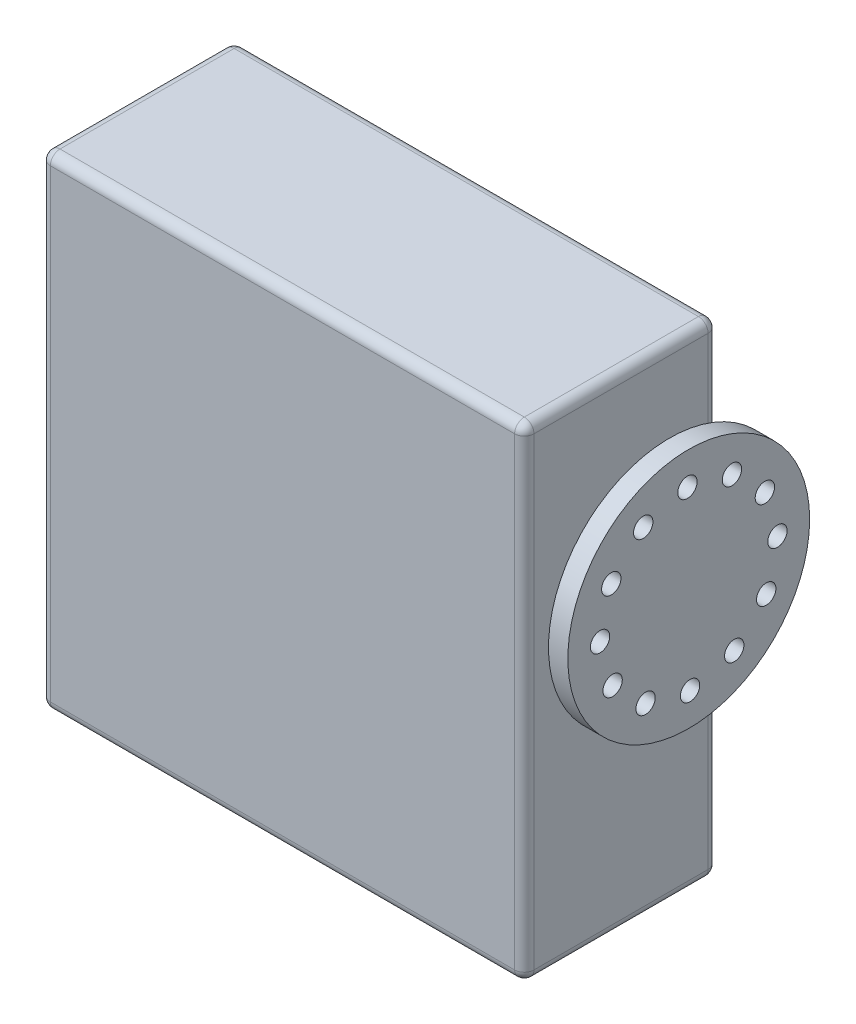
ISO-10303-21;
HEADER;
FILE_DESCRIPTION(('STEP AP214'),'2;1');
FILE_NAME('part.step','',(''),(''),'','','');
FILE_SCHEMA(('AUTOMOTIVE_DESIGN { 1 0 10303 214 1 1 1 1 }'));
ENDSEC;
DATA;
#1=APPLICATION_CONTEXT('core data for automotive mechanical design processes');
#2=APPLICATION_PROTOCOL_DEFINITION('international standard','automotive_design',2000,#1);
#3=PRODUCT_CONTEXT('',#1,'mechanical');
#4=PRODUCT('Part','Part','',(#3));
#5=PRODUCT_RELATED_PRODUCT_CATEGORY('part','',(#4));
#6=PRODUCT_DEFINITION_FORMATION('','',#4);
#7=PRODUCT_DEFINITION_CONTEXT('part definition',#1,'design');
#8=PRODUCT_DEFINITION('design','',#6,#7);
#9=PRODUCT_DEFINITION_SHAPE('','',#8);
#10=(LENGTH_UNIT() NAMED_UNIT(*) SI_UNIT(.MILLI.,.METRE.));
#11=(NAMED_UNIT(*) PLANE_ANGLE_UNIT() SI_UNIT($,.RADIAN.));
#12=(NAMED_UNIT(*) SI_UNIT($,.STERADIAN.) SOLID_ANGLE_UNIT());
#13=UNCERTAINTY_MEASURE_WITH_UNIT(LENGTH_MEASURE(1.E-05),#10,'distance_accuracy_value','');
#14=(GEOMETRIC_REPRESENTATION_CONTEXT(3) GLOBAL_UNCERTAINTY_ASSIGNED_CONTEXT((#13)) GLOBAL_UNIT_ASSIGNED_CONTEXT((#10,
#11,#12)) REPRESENTATION_CONTEXT('',''));
#15=CARTESIAN_POINT('',(0.,0.,0.));
#16=DIRECTION('',(0.,0.,1.));
#17=DIRECTION('',(1.,0.,0.));
#18=AXIS2_PLACEMENT_3D('',#15,#16,#17);
#19=CARTESIAN_POINT('',(50.,0.,20.));
#20=DIRECTION('',(-1.,0.,0.));
#21=DIRECTION('',(0.,0.,1.));
#22=AXIS2_PLACEMENT_3D('',#19,#20,#21);
#23=PLANE('',#22);
#24=DIRECTION('',(0.,0.,-1.));
#25=VECTOR('',#24,1.);
#26=CARTESIAN_POINT('',(50.,49.,20.));
#27=LINE('',#26,#25);
#28=CARTESIAN_POINT('',(50.,49.,1.));
#29=VERTEX_POINT('',#28);
#30=CARTESIAN_POINT('',(50.,49.,19.));
#31=VERTEX_POINT('',#30);
#32=EDGE_CURVE('E160',#29,#31,#27,.F.);
#33=ORIENTED_EDGE('',*,*,#32,.T.);
#34=DIRECTION('',(0.,1.,0.));
#35=VECTOR('',#34,1.);
#36=CARTESIAN_POINT('',(50.,0.,19.));
#37=LINE('',#36,#35);
#38=CARTESIAN_POINT('',(50.,1.,19.));
#39=VERTEX_POINT('',#38);
#40=EDGE_CURVE('E130',#31,#39,#37,.F.);
#41=ORIENTED_EDGE('',*,*,#40,.T.);
#42=DIRECTION('',(0.,0.,-1.));
#43=VECTOR('',#42,1.);
#44=CARTESIAN_POINT('',(50.,1.,20.));
#45=LINE('',#44,#43);
#46=CARTESIAN_POINT('',(50.,1.,1.));
#47=VERTEX_POINT('',#46);
#48=EDGE_CURVE('E167',#39,#47,#45,.T.);
#49=ORIENTED_EDGE('',*,*,#48,.T.);
#50=DIRECTION('',(0.,1.,0.));
#51=VECTOR('',#50,1.);
#52=CARTESIAN_POINT('',(50.,50.,1.));
#53=LINE('',#52,#51);
#54=EDGE_CURVE('E165',#47,#29,#53,.T.);
#55=ORIENTED_EDGE('',*,*,#54,.T.);
#56=EDGE_LOOP('',(#33,#41,#49,#55));
#57=FACE_BOUND('',#56,.T.);
#58=CARTESIAN_POINT('',(50.,34.1132623120046,10.));
#59=DIRECTION('',(-1.,0.,0.));
#60=DIRECTION('',(0.,0.,1.));
#61=AXIS2_PLACEMENT_3D('',#58,#59,#60);
#62=CIRCLE('',#61,2.5);
#63=CARTESIAN_POINT('',(50.,34.1132623120046,12.5));
#64=VERTEX_POINT('',#63);
#65=EDGE_CURVE('E153',#64,#64,#62,.F.);
#66=ORIENTED_EDGE('',*,*,#65,.F.);
#67=EDGE_LOOP('',(#66));
#68=FACE_BOUND('',#67,.T.);
#69=ADVANCED_FACE('F34',(#57,#68),#23,.F.);
#70=CARTESIAN_POINT('',(0.,0.,20.));
#71=DIRECTION('',(1.,0.,0.));
#72=DIRECTION('',(0.,0.,-1.));
#73=AXIS2_PLACEMENT_3D('',#70,#71,#72);
#74=PLANE('',#73);
#75=DIRECTION('',(0.,0.,-1.));
#76=VECTOR('',#75,1.);
#77=CARTESIAN_POINT('',(0.,1.,20.));
#78=LINE('',#77,#76);
#79=CARTESIAN_POINT('',(0.,1.,1.));
#80=VERTEX_POINT('',#79);
#81=CARTESIAN_POINT('',(0.,1.,19.));
#82=VERTEX_POINT('',#81);
#83=EDGE_CURVE('E174',#80,#82,#78,.F.);
#84=ORIENTED_EDGE('',*,*,#83,.T.);
#85=DIRECTION('',(0.,-1.,0.));
#86=VECTOR('',#85,1.);
#87=CARTESIAN_POINT('',(0.,0.,19.));
#88=LINE('',#87,#86);
#89=CARTESIAN_POINT('',(0.,49.,19.));
#90=VERTEX_POINT('',#89);
#91=EDGE_CURVE('E176',#82,#90,#88,.F.);
#92=ORIENTED_EDGE('',*,*,#91,.T.);
#93=DIRECTION('',(0.,0.,-1.));
#94=VECTOR('',#93,1.);
#95=CARTESIAN_POINT('',(0.,49.,20.));
#96=LINE('',#95,#94);
#97=CARTESIAN_POINT('',(0.,49.,1.));
#98=VERTEX_POINT('',#97);
#99=EDGE_CURVE('E170',#90,#98,#96,.T.);
#100=ORIENTED_EDGE('',*,*,#99,.T.);
#101=DIRECTION('',(0.,-1.,0.));
#102=VECTOR('',#101,1.);
#103=CARTESIAN_POINT('',(0.,0.,1.));
#104=LINE('',#103,#102);
#105=EDGE_CURVE('E172',#98,#80,#104,.T.);
#106=ORIENTED_EDGE('',*,*,#105,.T.);
#107=EDGE_LOOP('',(#84,#92,#100,#106));
#108=FACE_BOUND('',#107,.T.);
#109=ADVANCED_FACE('F281',(#108),#74,.F.);
#110=CARTESIAN_POINT('',(0.,0.,20.));
#111=DIRECTION('',(0.,1.,0.));
#112=DIRECTION('',(0.,0.,1.));
#113=AXIS2_PLACEMENT_3D('',#110,#111,#112);
#114=PLANE('',#113);
#115=DIRECTION('',(1.,0.,0.));
#116=VECTOR('',#115,1.);
#117=CARTESIAN_POINT('',(0.,0.,19.));
#118=LINE('',#117,#116);
#119=CARTESIAN_POINT('',(49.,0.,19.));
#120=VERTEX_POINT('',#119);
#121=CARTESIAN_POINT('',(1.,0.,19.));
#122=VERTEX_POINT('',#121);
#123=EDGE_CURVE('E183',#120,#122,#118,.F.);
#124=ORIENTED_EDGE('',*,*,#123,.T.);
#125=DIRECTION('',(0.,0.,-1.));
#126=VECTOR('',#125,1.);
#127=CARTESIAN_POINT('',(1.,0.,20.));
#128=LINE('',#127,#126);
#129=CARTESIAN_POINT('',(1.,0.,1.));
#130=VERTEX_POINT('',#129);
#131=EDGE_CURVE('E185',#122,#130,#128,.T.);
#132=ORIENTED_EDGE('',*,*,#131,.T.);
#133=DIRECTION('',(1.,0.,0.));
#134=VECTOR('',#133,1.);
#135=CARTESIAN_POINT('',(50.,0.,1.));
#136=LINE('',#135,#134);
#137=CARTESIAN_POINT('',(49.,0.,1.));
#138=VERTEX_POINT('',#137);
#139=EDGE_CURVE('E179',#130,#138,#136,.T.);
#140=ORIENTED_EDGE('',*,*,#139,.T.);
#141=DIRECTION('',(0.,0.,-1.));
#142=VECTOR('',#141,1.);
#143=CARTESIAN_POINT('',(49.,0.,20.));
#144=LINE('',#143,#142);
#145=EDGE_CURVE('E181',#138,#120,#144,.F.);
#146=ORIENTED_EDGE('',*,*,#145,.T.);
#147=EDGE_LOOP('',(#124,#132,#140,#146));
#148=FACE_BOUND('',#147,.T.);
#149=ADVANCED_FACE('F287',(#148),#114,.F.);
#150=CARTESIAN_POINT('',(0.,50.,20.));
#151=DIRECTION('',(0.,-1.,0.));
#152=DIRECTION('',(0.,0.,-1.));
#153=AXIS2_PLACEMENT_3D('',#150,#151,#152);
#154=PLANE('',#153);
#155=DIRECTION('',(-1.,0.,0.));
#156=VECTOR('',#155,1.);
#157=CARTESIAN_POINT('',(0.,50.,19.));
#158=LINE('',#157,#156);
#159=CARTESIAN_POINT('',(1.,50.,19.));
#160=VERTEX_POINT('',#159);
#161=CARTESIAN_POINT('',(49.,50.,19.));
#162=VERTEX_POINT('',#161);
#163=EDGE_CURVE('E43',#160,#162,#158,.F.);
#164=ORIENTED_EDGE('',*,*,#163,.T.);
#165=DIRECTION('',(0.,0.,-1.));
#166=VECTOR('',#165,1.);
#167=CARTESIAN_POINT('',(49.,50.,20.));
#168=LINE('',#167,#166);
#169=CARTESIAN_POINT('',(49.,50.,1.));
#170=VERTEX_POINT('',#169);
#171=EDGE_CURVE('E11',#162,#170,#168,.T.);
#172=ORIENTED_EDGE('',*,*,#171,.T.);
#173=DIRECTION('',(-1.,0.,0.));
#174=VECTOR('',#173,1.);
#175=CARTESIAN_POINT('',(0.,50.,1.));
#176=LINE('',#175,#174);
#177=CARTESIAN_POINT('',(1.,50.,1.));
#178=VERTEX_POINT('',#177);
#179=EDGE_CURVE('E197',#170,#178,#176,.T.);
#180=ORIENTED_EDGE('',*,*,#179,.T.);
#181=DIRECTION('',(0.,0.,-1.));
#182=VECTOR('',#181,1.);
#183=CARTESIAN_POINT('',(1.,50.,20.));
#184=LINE('',#183,#182);
#185=EDGE_CURVE('E54',#178,#160,#184,.F.);
#186=ORIENTED_EDGE('',*,*,#185,.T.);
#187=EDGE_LOOP('',(#164,#172,#180,#186));
#188=FACE_BOUND('',#187,.T.);
#189=ADVANCED_FACE('F292',(#188),#154,.F.);
#190=CARTESIAN_POINT('',(0.,0.,20.));
#191=DIRECTION('',(0.,0.,-1.));
#192=DIRECTION('',(-1.,0.,0.));
#193=AXIS2_PLACEMENT_3D('',#190,#191,#192);
#194=PLANE('',#193);
#195=DIRECTION('',(0.,-1.,0.));
#196=VECTOR('',#195,1.);
#197=CARTESIAN_POINT('',(1.,0.,20.));
#198=LINE('',#197,#196);
#199=CARTESIAN_POINT('',(1.,49.,20.));
#200=VERTEX_POINT('',#199);
#201=CARTESIAN_POINT('',(1.,1.,20.));
#202=VERTEX_POINT('',#201);
#203=EDGE_CURVE('E152',#200,#202,#198,.T.);
#204=ORIENTED_EDGE('',*,*,#203,.T.);
#205=DIRECTION('',(1.,0.,0.));
#206=VECTOR('',#205,1.);
#207=CARTESIAN_POINT('',(0.,1.,20.));
#208=LINE('',#207,#206);
#209=CARTESIAN_POINT('',(49.,1.,20.));
#210=VERTEX_POINT('',#209);
#211=EDGE_CURVE('E157',#202,#210,#208,.T.);
#212=ORIENTED_EDGE('',*,*,#211,.T.);
#213=DIRECTION('',(0.,1.,0.));
#214=VECTOR('',#213,1.);
#215=CARTESIAN_POINT('',(49.,0.,20.));
#216=LINE('',#215,#214);
#217=CARTESIAN_POINT('',(49.,49.,20.));
#218=VERTEX_POINT('',#217);
#219=EDGE_CURVE('E128',#210,#218,#216,.T.);
#220=ORIENTED_EDGE('',*,*,#219,.T.);
#221=DIRECTION('',(-1.,0.,0.));
#222=VECTOR('',#221,1.);
#223=CARTESIAN_POINT('',(0.,49.,20.));
#224=LINE('',#223,#222);
#225=EDGE_CURVE('E146',#218,#200,#224,.T.);
#226=ORIENTED_EDGE('',*,*,#225,.T.);
#227=EDGE_LOOP('',(#204,#212,#220,#226));
#228=FACE_BOUND('',#227,.T.);
#229=ADVANCED_FACE('F155',(#228),#194,.F.);
#230=CARTESIAN_POINT('',(0.,0.,0.));
#231=DIRECTION('',(0.,0.,-1.));
#232=DIRECTION('',(-1.,0.,0.));
#233=AXIS2_PLACEMENT_3D('',#230,#231,#232);
#234=PLANE('',#233);
#235=DIRECTION('',(0.,1.,0.));
#236=VECTOR('',#235,1.);
#237=CARTESIAN_POINT('',(49.,0.,0.));
#238=LINE('',#237,#236);
#239=CARTESIAN_POINT('',(49.,49.,0.));
#240=VERTEX_POINT('',#239);
#241=CARTESIAN_POINT('',(49.,1.,0.));
#242=VERTEX_POINT('',#241);
#243=EDGE_CURVE('E192',#240,#242,#238,.F.);
#244=ORIENTED_EDGE('',*,*,#243,.T.);
#245=DIRECTION('',(1.,0.,0.));
#246=VECTOR('',#245,1.);
#247=CARTESIAN_POINT('',(0.,1.,0.));
#248=LINE('',#247,#246);
#249=CARTESIAN_POINT('',(1.,1.,0.));
#250=VERTEX_POINT('',#249);
#251=EDGE_CURVE('E194',#242,#250,#248,.F.);
#252=ORIENTED_EDGE('',*,*,#251,.T.);
#253=DIRECTION('',(0.,-1.,0.));
#254=VECTOR('',#253,1.);
#255=CARTESIAN_POINT('',(1.,50.,0.));
#256=LINE('',#255,#254);
#257=CARTESIAN_POINT('',(1.,49.,0.));
#258=VERTEX_POINT('',#257);
#259=EDGE_CURVE('E190',#250,#258,#256,.F.);
#260=ORIENTED_EDGE('',*,*,#259,.T.);
#261=DIRECTION('',(-1.,0.,0.));
#262=VECTOR('',#261,1.);
#263=CARTESIAN_POINT('',(50.,49.,0.));
#264=LINE('',#263,#262);
#265=EDGE_CURVE('E188',#258,#240,#264,.F.);
#266=ORIENTED_EDGE('',*,*,#265,.T.);
#267=EDGE_LOOP('',(#244,#252,#260,#266));
#268=FACE_BOUND('',#267,.T.);
#269=ADVANCED_FACE('F380',(#268),#234,.T.);
#270=CARTESIAN_POINT('',(55.,34.1132623120046,10.));
#271=DIRECTION('',(-1.,0.,0.));
#272=DIRECTION('',(0.,0.,1.));
#273=AXIS2_PLACEMENT_3D('',#270,#271,#272);
#274=CYLINDRICAL_SURFACE('',#273,2.5);
#275=CARTESIAN_POINT('',(55.,34.1132623120046,10.));
#276=DIRECTION('',(1.,0.,0.));
#277=DIRECTION('',(0.,0.,-1.));
#278=AXIS2_PLACEMENT_3D('',#275,#276,#277);
#279=CIRCLE('',#278,2.5);
#280=CARTESIAN_POINT('',(55.,34.1132623120046,7.5));
#281=VERTEX_POINT('',#280);
#282=EDGE_CURVE('E269',#281,#281,#279,.T.);
#283=ORIENTED_EDGE('',*,*,#282,.F.);
#284=EDGE_LOOP('',(#283));
#285=FACE_BOUND('',#284,.T.);
#286=ORIENTED_EDGE('',*,*,#65,.T.);
#287=EDGE_LOOP('',(#286));
#288=FACE_BOUND('',#287,.T.);
#289=ADVANCED_FACE('F278',(#285,#288),#274,.T.);
#290=CARTESIAN_POINT('',(55.,34.1132623120046,10.));
#291=DIRECTION('',(1.,0.,0.));
#292=DIRECTION('',(0.,0.,-1.));
#293=AXIS2_PLACEMENT_3D('',#290,#291,#292);
#294=PLANE('',#293);
#295=CARTESIAN_POINT('',(55.,38.8173121010036,2.1291466211071));
#296=DIRECTION('',(1.,0.,0.));
#297=DIRECTION('',(0.,0.,-1.));
#298=AXIS2_PLACEMENT_3D('',#295,#296,#297);
#299=CIRCLE('',#298,0.999999999999994);
#300=CARTESIAN_POINT('',(55.,38.8173121010036,1.1291466211071));
#301=VERTEX_POINT('',#300);
#302=EDGE_CURVE('E471',#301,#301,#299,.T.);
#303=ORIENTED_EDGE('',*,*,#302,.T.);
#304=EDGE_LOOP('',(#303));
#305=FACE_BOUND('',#304,.T.);
#306=CARTESIAN_POINT('',(55.,42.122515619391,5.53566591891567));
#307=DIRECTION('',(1.,0.,0.));
#308=DIRECTION('',(0.,0.,-1.));
#309=AXIS2_PLACEMENT_3D('',#306,#307,#308);
#310=CIRCLE('',#309,0.999999999999994);
#311=CARTESIAN_POINT('',(55.,42.122515619391,4.53566591891568));
#312=VERTEX_POINT('',#311);
#313=EDGE_CURVE('E481',#312,#312,#310,.T.);
#314=ORIENTED_EDGE('',*,*,#313,.T.);
#315=EDGE_LOOP('',(#314));
#316=FACE_BOUND('',#315,.T.);
#317=CARTESIAN_POINT('',(55.,43.281646182088,10.1383999284935));
#318=DIRECTION('',(1.,0.,0.));
#319=DIRECTION('',(0.,0.,-1.));
#320=AXIS2_PLACEMENT_3D('',#317,#318,#319);
#321=CIRCLE('',#320,0.999999999999994);
#322=CARTESIAN_POINT('',(55.,43.281646182088,9.13839992849354));
#323=VERTEX_POINT('',#322);
#324=EDGE_CURVE('E487',#323,#323,#321,.T.);
#325=ORIENTED_EDGE('',*,*,#324,.T.);
#326=EDGE_LOOP('',(#325));
#327=FACE_BOUND('',#326,.T.);
#328=CARTESIAN_POINT('',(55.,41.9841156908975,14.704049788999));
#329=DIRECTION('',(1.,0.,0.));
#330=DIRECTION('',(0.,0.,-1.));
#331=AXIS2_PLACEMENT_3D('',#328,#329,#330);
#332=CIRCLE('',#331,0.999999999999994);
#333=CARTESIAN_POINT('',(55.,41.9841156908975,13.704049788999));
#334=VERTEX_POINT('',#333);
#335=EDGE_CURVE('E493',#334,#334,#332,.T.);
#336=ORIENTED_EDGE('',*,*,#335,.T.);
#337=EDGE_LOOP('',(#336));
#338=FACE_BOUND('',#337,.T.);
#339=CARTESIAN_POINT('',(55.,38.5775963930889,18.0092533073864));
#340=DIRECTION('',(1.,0.,0.));
#341=DIRECTION('',(0.,0.,-1.));
#342=AXIS2_PLACEMENT_3D('',#339,#340,#341);
#343=CIRCLE('',#342,0.999999999999994);
#344=CARTESIAN_POINT('',(55.,38.5775963930889,17.0092533073864));
#345=VERTEX_POINT('',#344);
#346=EDGE_CURVE('E499',#345,#345,#343,.T.);
#347=ORIENTED_EDGE('',*,*,#346,.T.);
#348=EDGE_LOOP('',(#347));
#349=FACE_BOUND('',#348,.T.);
#350=CARTESIAN_POINT('',(55.,33.974862383511,19.1683838700833));
#351=DIRECTION('',(1.,0.,0.));
#352=DIRECTION('',(0.,0.,-1.));
#353=AXIS2_PLACEMENT_3D('',#350,#351,#352);
#354=CIRCLE('',#353,0.999999999999994);
#355=CARTESIAN_POINT('',(55.,33.974862383511,18.1683838700833));
#356=VERTEX_POINT('',#355);
#357=EDGE_CURVE('E505',#356,#356,#354,.T.);
#358=ORIENTED_EDGE('',*,*,#357,.T.);
#359=EDGE_LOOP('',(#358));
#360=FACE_BOUND('',#359,.T.);
#361=CARTESIAN_POINT('',(55.,29.4092125230056,17.8708533788929));
#362=DIRECTION('',(1.,0.,0.));
#363=DIRECTION('',(0.,0.,-1.));
#364=AXIS2_PLACEMENT_3D('',#361,#362,#363);
#365=CIRCLE('',#364,0.999999999999994);
#366=CARTESIAN_POINT('',(55.,29.4092125230056,16.8708533788929));
#367=VERTEX_POINT('',#366);
#368=EDGE_CURVE('E511',#367,#367,#365,.T.);
#369=ORIENTED_EDGE('',*,*,#368,.T.);
#370=EDGE_LOOP('',(#369));
#371=FACE_BOUND('',#370,.T.);
#372=CARTESIAN_POINT('',(55.,26.1040090046182,14.4643340810843));
#373=DIRECTION('',(1.,0.,0.));
#374=DIRECTION('',(0.,0.,-1.));
#375=AXIS2_PLACEMENT_3D('',#372,#373,#374);
#376=CIRCLE('',#375,0.999999999999994);
#377=CARTESIAN_POINT('',(55.,26.1040090046182,13.4643340810843));
#378=VERTEX_POINT('',#377);
#379=EDGE_CURVE('E517',#378,#378,#376,.T.);
#380=ORIENTED_EDGE('',*,*,#379,.T.);
#381=EDGE_LOOP('',(#380));
#382=FACE_BOUND('',#381,.T.);
#383=CARTESIAN_POINT('',(55.,24.9448784419213,9.86160007150641));
#384=DIRECTION('',(1.,0.,0.));
#385=DIRECTION('',(0.,0.,-1.));
#386=AXIS2_PLACEMENT_3D('',#383,#384,#385);
#387=CIRCLE('',#386,0.999999999999994);
#388=CARTESIAN_POINT('',(55.,24.9448784419213,8.86160007150642));
#389=VERTEX_POINT('',#388);
#390=EDGE_CURVE('E523',#389,#389,#387,.T.);
#391=ORIENTED_EDGE('',*,*,#390,.T.);
#392=EDGE_LOOP('',(#391));
#393=FACE_BOUND('',#392,.T.);
#394=CARTESIAN_POINT('',(55.,26.2424089331118,5.29595021100093));
#395=DIRECTION('',(1.,0.,0.));
#396=DIRECTION('',(0.,0.,-1.));
#397=AXIS2_PLACEMENT_3D('',#394,#395,#396);
#398=CIRCLE('',#397,0.999999999999994);
#399=CARTESIAN_POINT('',(55.,26.2424089331118,4.29595021100093));
#400=VERTEX_POINT('',#399);
#401=EDGE_CURVE('E529',#400,#400,#398,.T.);
#402=ORIENTED_EDGE('',*,*,#401,.T.);
#403=EDGE_LOOP('',(#402));
#404=FACE_BOUND('',#403,.T.);
#405=CARTESIAN_POINT('',(55.,29.6489282309204,1.99074669261354));
#406=DIRECTION('',(1.,0.,0.));
#407=DIRECTION('',(0.,0.,-1.));
#408=AXIS2_PLACEMENT_3D('',#405,#406,#407);
#409=CIRCLE('',#408,0.999999999999994);
#410=CARTESIAN_POINT('',(55.,29.6489282309204,0.990746692613547));
#411=VERTEX_POINT('',#410);
#412=EDGE_CURVE('E535',#411,#411,#409,.T.);
#413=ORIENTED_EDGE('',*,*,#412,.T.);
#414=EDGE_LOOP('',(#413));
#415=FACE_BOUND('',#414,.T.);
#416=CARTESIAN_POINT('',(55.,34.2516622404982,0.831616129916668));
#417=DIRECTION('',(1.,0.,0.));
#418=DIRECTION('',(0.,0.,-1.));
#419=AXIS2_PLACEMENT_3D('',#416,#417,#418);
#420=CIRCLE('',#419,0.999999999999994);
#421=CARTESIAN_POINT('',(55.,34.2516622404982,-0.168383870083326));
#422=VERTEX_POINT('',#421);
#423=EDGE_CURVE('E134',#422,#422,#420,.T.);
#424=ORIENTED_EDGE('',*,*,#423,.T.);
#425=EDGE_LOOP('',(#424));
#426=FACE_BOUND('',#425,.T.);
#427=CARTESIAN_POINT('',(55.,34.1132623120046,10.));
#428=DIRECTION('',(1.,0.,0.));
#429=DIRECTION('',(0.,0.,-1.));
#430=AXIS2_PLACEMENT_3D('',#427,#428,#429);
#431=CIRCLE('',#430,12.5);
#432=CARTESIAN_POINT('',(55.,34.1132623120046,-2.5));
#433=VERTEX_POINT('',#432);
#434=EDGE_CURVE('E257',#433,#433,#431,.T.);
#435=ORIENTED_EDGE('',*,*,#434,.F.);
#436=EDGE_LOOP('',(#435));
#437=FACE_BOUND('',#436,.T.);
#438=ORIENTED_EDGE('',*,*,#282,.T.);
#439=EDGE_LOOP('',(#438));
#440=FACE_BOUND('',#439,.T.);
#441=ADVANCED_FACE('F408',(#305,#316,#327,#338,#349,#360,#371,#382,#393,#404,#415,#426,#437,
#440),#294,.F.);
#442=CARTESIAN_POINT('',(57.,34.1132623120046,10.));
#443=DIRECTION('',(-1.,0.,0.));
#444=DIRECTION('',(0.,0.,1.));
#445=AXIS2_PLACEMENT_3D('',#442,#443,#444);
#446=CYLINDRICAL_SURFACE('',#445,12.5);
#447=CARTESIAN_POINT('',(57.,34.1132623120046,10.));
#448=DIRECTION('',(1.,0.,0.));
#449=DIRECTION('',(0.,0.,-1.));
#450=AXIS2_PLACEMENT_3D('',#447,#448,#449);
#451=CIRCLE('',#450,12.5);
#452=CARTESIAN_POINT('',(57.,34.1132623120046,-2.5));
#453=VERTEX_POINT('',#452);
#454=EDGE_CURVE('E264',#453,#453,#451,.T.);
#455=ORIENTED_EDGE('',*,*,#454,.F.);
#456=EDGE_LOOP('',(#455));
#457=FACE_BOUND('',#456,.T.);
#458=ORIENTED_EDGE('',*,*,#434,.T.);
#459=EDGE_LOOP('',(#458));
#460=FACE_BOUND('',#459,.T.);
#461=ADVANCED_FACE('F410',(#457,#460),#446,.T.);
#462=CARTESIAN_POINT('',(57.,34.1132623120046,10.));
#463=DIRECTION('',(1.,0.,0.));
#464=DIRECTION('',(0.,0.,-1.));
#465=AXIS2_PLACEMENT_3D('',#462,#463,#464);
#466=PLANE('',#465);
#467=CARTESIAN_POINT('',(57.,38.8173121010036,2.1291466211071));
#468=DIRECTION('',(1.,0.,0.));
#469=DIRECTION('',(0.,0.,-1.));
#470=AXIS2_PLACEMENT_3D('',#467,#468,#469);
#471=CIRCLE('',#470,0.999999999999987);
#472=CARTESIAN_POINT('',(57.,38.8173121010036,1.12914662110711));
#473=VERTEX_POINT('',#472);
#474=EDGE_CURVE('E474',#473,#473,#471,.T.);
#475=ORIENTED_EDGE('',*,*,#474,.F.);
#476=EDGE_LOOP('',(#475));
#477=FACE_BOUND('',#476,.T.);
#478=CARTESIAN_POINT('',(57.,42.122515619391,5.53566591891567));
#479=DIRECTION('',(1.,0.,0.));
#480=DIRECTION('',(0.,0.,-1.));
#481=AXIS2_PLACEMENT_3D('',#478,#479,#480);
#482=CIRCLE('',#481,0.999999999999987);
#483=CARTESIAN_POINT('',(57.,42.122515619391,4.53566591891568));
#484=VERTEX_POINT('',#483);
#485=EDGE_CURVE('E476',#484,#484,#482,.T.);
#486=ORIENTED_EDGE('',*,*,#485,.F.);
#487=EDGE_LOOP('',(#486));
#488=FACE_BOUND('',#487,.T.);
#489=CARTESIAN_POINT('',(57.,43.281646182088,10.1383999284935));
#490=DIRECTION('',(1.,0.,0.));
#491=DIRECTION('',(0.,0.,-1.));
#492=AXIS2_PLACEMENT_3D('',#489,#490,#491);
#493=CIRCLE('',#492,0.999999999999987);
#494=CARTESIAN_POINT('',(57.,43.281646182088,9.13839992849354));
#495=VERTEX_POINT('',#494);
#496=EDGE_CURVE('E484',#495,#495,#493,.T.);
#497=ORIENTED_EDGE('',*,*,#496,.F.);
#498=EDGE_LOOP('',(#497));
#499=FACE_BOUND('',#498,.T.);
#500=CARTESIAN_POINT('',(57.,41.9841156908975,14.704049788999));
#501=DIRECTION('',(1.,0.,0.));
#502=DIRECTION('',(0.,0.,-1.));
#503=AXIS2_PLACEMENT_3D('',#500,#501,#502);
#504=CIRCLE('',#503,0.999999999999987);
#505=CARTESIAN_POINT('',(57.,41.9841156908975,13.704049788999));
#506=VERTEX_POINT('',#505);
#507=EDGE_CURVE('E490',#506,#506,#504,.T.);
#508=ORIENTED_EDGE('',*,*,#507,.F.);
#509=EDGE_LOOP('',(#508));
#510=FACE_BOUND('',#509,.T.);
#511=CARTESIAN_POINT('',(57.,38.5775963930889,18.0092533073864));
#512=DIRECTION('',(1.,0.,0.));
#513=DIRECTION('',(0.,0.,-1.));
#514=AXIS2_PLACEMENT_3D('',#511,#512,#513);
#515=CIRCLE('',#514,0.999999999999987);
#516=CARTESIAN_POINT('',(57.,38.5775963930889,17.0092533073864));
#517=VERTEX_POINT('',#516);
#518=EDGE_CURVE('E496',#517,#517,#515,.T.);
#519=ORIENTED_EDGE('',*,*,#518,.F.);
#520=EDGE_LOOP('',(#519));
#521=FACE_BOUND('',#520,.T.);
#522=CARTESIAN_POINT('',(57.,33.974862383511,19.1683838700833));
#523=DIRECTION('',(1.,0.,0.));
#524=DIRECTION('',(0.,0.,-1.));
#525=AXIS2_PLACEMENT_3D('',#522,#523,#524);
#526=CIRCLE('',#525,0.999999999999987);
#527=CARTESIAN_POINT('',(57.,33.974862383511,18.1683838700833));
#528=VERTEX_POINT('',#527);
#529=EDGE_CURVE('E502',#528,#528,#526,.T.);
#530=ORIENTED_EDGE('',*,*,#529,.F.);
#531=EDGE_LOOP('',(#530));
#532=FACE_BOUND('',#531,.T.);
#533=CARTESIAN_POINT('',(57.,29.4092125230056,17.8708533788929));
#534=DIRECTION('',(1.,0.,0.));
#535=DIRECTION('',(0.,0.,-1.));
#536=AXIS2_PLACEMENT_3D('',#533,#534,#535);
#537=CIRCLE('',#536,0.99999999999999);
#538=CARTESIAN_POINT('',(57.,29.4092125230056,16.8708533788929));
#539=VERTEX_POINT('',#538);
#540=EDGE_CURVE('E508',#539,#539,#537,.T.);
#541=ORIENTED_EDGE('',*,*,#540,.F.);
#542=EDGE_LOOP('',(#541));
#543=FACE_BOUND('',#542,.T.);
#544=CARTESIAN_POINT('',(57.,26.1040090046182,14.4643340810843));
#545=DIRECTION('',(1.,0.,0.));
#546=DIRECTION('',(0.,0.,-1.));
#547=AXIS2_PLACEMENT_3D('',#544,#545,#546);
#548=CIRCLE('',#547,0.999999999999987);
#549=CARTESIAN_POINT('',(57.,26.1040090046182,13.4643340810843));
#550=VERTEX_POINT('',#549);
#551=EDGE_CURVE('E514',#550,#550,#548,.T.);
#552=ORIENTED_EDGE('',*,*,#551,.F.);
#553=EDGE_LOOP('',(#552));
#554=FACE_BOUND('',#553,.T.);
#555=CARTESIAN_POINT('',(57.,24.9448784419213,9.86160007150641));
#556=DIRECTION('',(1.,0.,0.));
#557=DIRECTION('',(0.,0.,-1.));
#558=AXIS2_PLACEMENT_3D('',#555,#556,#557);
#559=CIRCLE('',#558,0.99999999999999);
#560=CARTESIAN_POINT('',(57.,24.9448784419213,8.86160007150642));
#561=VERTEX_POINT('',#560);
#562=EDGE_CURVE('E520',#561,#561,#559,.T.);
#563=ORIENTED_EDGE('',*,*,#562,.F.);
#564=EDGE_LOOP('',(#563));
#565=FACE_BOUND('',#564,.T.);
#566=CARTESIAN_POINT('',(57.,26.2424089331118,5.29595021100093));
#567=DIRECTION('',(1.,0.,0.));
#568=DIRECTION('',(0.,0.,-1.));
#569=AXIS2_PLACEMENT_3D('',#566,#567,#568);
#570=CIRCLE('',#569,0.999999999999987);
#571=CARTESIAN_POINT('',(57.,26.2424089331118,4.29595021100094));
#572=VERTEX_POINT('',#571);
#573=EDGE_CURVE('E526',#572,#572,#570,.T.);
#574=ORIENTED_EDGE('',*,*,#573,.F.);
#575=EDGE_LOOP('',(#574));
#576=FACE_BOUND('',#575,.T.);
#577=CARTESIAN_POINT('',(57.,29.6489282309204,1.99074669261354));
#578=DIRECTION('',(1.,0.,0.));
#579=DIRECTION('',(0.,0.,-1.));
#580=AXIS2_PLACEMENT_3D('',#577,#578,#579);
#581=CIRCLE('',#580,0.999999999999987);
#582=CARTESIAN_POINT('',(57.,29.6489282309204,0.990746692613554));
#583=VERTEX_POINT('',#582);
#584=EDGE_CURVE('E532',#583,#583,#581,.T.);
#585=ORIENTED_EDGE('',*,*,#584,.F.);
#586=EDGE_LOOP('',(#585));
#587=FACE_BOUND('',#586,.T.);
#588=CARTESIAN_POINT('',(57.,34.2516622404982,0.831616129916668));
#589=DIRECTION('',(1.,0.,0.));
#590=DIRECTION('',(0.,0.,-1.));
#591=AXIS2_PLACEMENT_3D('',#588,#589,#590);
#592=CIRCLE('',#591,0.999999999999987);
#593=CARTESIAN_POINT('',(57.,34.2516622404982,-0.168383870083319));
#594=VERTEX_POINT('',#593);
#595=EDGE_CURVE('E538',#594,#594,#592,.T.);
#596=ORIENTED_EDGE('',*,*,#595,.F.);
#597=EDGE_LOOP('',(#596));
#598=FACE_BOUND('',#597,.T.);
#599=ORIENTED_EDGE('',*,*,#454,.T.);
#600=EDGE_LOOP('',(#599));
#601=FACE_BOUND('',#600,.T.);
#602=ADVANCED_FACE('F367',(#477,#488,#499,#510,#521,#532,#543,#554,#565,#576,#587,#598,#601),
#466,.T.);
#603=CARTESIAN_POINT('',(1.,0.,1.));
#604=DIRECTION('',(0.,1.,0.));
#605=DIRECTION('',(0.,0.,1.));
#606=AXIS2_PLACEMENT_3D('',#603,#604,#605);
#607=CYLINDRICAL_SURFACE('',#606,1.);
#608=CARTESIAN_POINT('',(1.,1.,1.));
#609=DIRECTION('',(0.,-1.,0.));
#610=DIRECTION('',(0.,0.,-1.));
#611=AXIS2_PLACEMENT_3D('',#608,#609,#610);
#612=CIRCLE('',#611,1.);
#613=EDGE_CURVE('E38',#80,#250,#612,.T.);
#614=ORIENTED_EDGE('',*,*,#613,.F.);
#615=ORIENTED_EDGE('',*,*,#105,.F.);
#616=CARTESIAN_POINT('',(1.,49.,1.));
#617=DIRECTION('',(0.,1.,0.));
#618=DIRECTION('',(0.,0.,1.));
#619=AXIS2_PLACEMENT_3D('',#616,#617,#618);
#620=CIRCLE('',#619,1.);
#621=EDGE_CURVE('E250',#258,#98,#620,.T.);
#622=ORIENTED_EDGE('',*,*,#621,.F.);
#623=ORIENTED_EDGE('',*,*,#259,.F.);
#624=EDGE_LOOP('',(#614,#615,#622,#623));
#625=FACE_BOUND('',#624,.T.);
#626=ADVANCED_FACE('F36',(#625),#607,.T.);
#627=CARTESIAN_POINT('',(1.,1.,1.));
#628=DIRECTION('',(0.,0.,1.));
#629=DIRECTION('',(1.,0.,0.));
#630=AXIS2_PLACEMENT_3D('',#627,#628,#629);
#631=SPHERICAL_SURFACE('',#630,1.);
#632=CARTESIAN_POINT('',(1.,1.,1.));
#633=DIRECTION('',(0.,0.,-1.));
#634=DIRECTION('',(-1.,0.,0.));
#635=AXIS2_PLACEMENT_3D('',#632,#633,#634);
#636=CIRCLE('',#635,1.);
#637=EDGE_CURVE('E246',#80,#130,#636,.F.);
#638=ORIENTED_EDGE('',*,*,#637,.F.);
#639=ORIENTED_EDGE('',*,*,#613,.T.);
#640=CARTESIAN_POINT('',(1.,1.,1.));
#641=DIRECTION('',(-1.,0.,0.));
#642=DIRECTION('',(0.,0.,1.));
#643=AXIS2_PLACEMENT_3D('',#640,#641,#642);
#644=CIRCLE('',#643,1.);
#645=EDGE_CURVE('E249',#130,#250,#644,.F.);
#646=ORIENTED_EDGE('',*,*,#645,.F.);
#647=EDGE_LOOP('',(#638,#639,#646));
#648=FACE_BOUND('',#647,.T.);
#649=ADVANCED_FACE('F362',(#648),#631,.T.);
#650=CARTESIAN_POINT('',(1.,49.,1.));
#651=DIRECTION('',(0.,0.,1.));
#652=DIRECTION('',(1.,0.,0.));
#653=AXIS2_PLACEMENT_3D('',#650,#651,#652);
#654=SPHERICAL_SURFACE('',#653,1.);
#655=CARTESIAN_POINT('',(1.,49.,1.));
#656=DIRECTION('',(-1.,0.,0.));
#657=DIRECTION('',(0.,0.,1.));
#658=AXIS2_PLACEMENT_3D('',#655,#656,#657);
#659=CIRCLE('',#658,1.);
#660=EDGE_CURVE('E240',#258,#178,#659,.F.);
#661=ORIENTED_EDGE('',*,*,#660,.F.);
#662=ORIENTED_EDGE('',*,*,#621,.T.);
#663=CARTESIAN_POINT('',(1.,49.,1.));
#664=DIRECTION('',(0.,0.,-1.));
#665=DIRECTION('',(-1.,0.,0.));
#666=AXIS2_PLACEMENT_3D('',#663,#664,#665);
#667=CIRCLE('',#666,1.);
#668=EDGE_CURVE('E243',#178,#98,#667,.F.);
#669=ORIENTED_EDGE('',*,*,#668,.F.);
#670=EDGE_LOOP('',(#661,#662,#669));
#671=FACE_BOUND('',#670,.T.);
#672=ADVANCED_FACE('F359',(#671),#654,.T.);
#673=CARTESIAN_POINT('',(0.,1.,1.));
#674=DIRECTION('',(-1.,0.,0.));
#675=DIRECTION('',(0.,0.,1.));
#676=AXIS2_PLACEMENT_3D('',#673,#674,#675);
#677=CYLINDRICAL_SURFACE('',#676,1.);
#678=ORIENTED_EDGE('',*,*,#645,.T.);
#679=ORIENTED_EDGE('',*,*,#251,.F.);
#680=CARTESIAN_POINT('',(49.,1.,1.));
#681=DIRECTION('',(1.,0.,0.));
#682=DIRECTION('',(0.,0.,-1.));
#683=AXIS2_PLACEMENT_3D('',#680,#681,#682);
#684=CIRCLE('',#683,1.);
#685=EDGE_CURVE('E234',#138,#242,#684,.T.);
#686=ORIENTED_EDGE('',*,*,#685,.F.);
#687=ORIENTED_EDGE('',*,*,#139,.F.);
#688=EDGE_LOOP('',(#678,#679,#686,#687));
#689=FACE_BOUND('',#688,.T.);
#690=ADVANCED_FACE('F355',(#689),#677,.T.);
#691=CARTESIAN_POINT('',(1.,1.,20.));
#692=DIRECTION('',(0.,0.,-1.));
#693=DIRECTION('',(-1.,0.,0.));
#694=AXIS2_PLACEMENT_3D('',#691,#692,#693);
#695=CYLINDRICAL_SURFACE('',#694,1.);
#696=ORIENTED_EDGE('',*,*,#637,.T.);
#697=ORIENTED_EDGE('',*,*,#131,.F.);
#698=CARTESIAN_POINT('',(1.,1.,19.));
#699=DIRECTION('',(0.,0.,1.));
#700=DIRECTION('',(1.,0.,0.));
#701=AXIS2_PLACEMENT_3D('',#698,#699,#700);
#702=CIRCLE('',#701,1.);
#703=EDGE_CURVE('E231',#82,#122,#702,.T.);
#704=ORIENTED_EDGE('',*,*,#703,.F.);
#705=ORIENTED_EDGE('',*,*,#83,.F.);
#706=EDGE_LOOP('',(#696,#697,#704,#705));
#707=FACE_BOUND('',#706,.T.);
#708=ADVANCED_FACE('F351',(#707),#695,.T.);
#709=CARTESIAN_POINT('',(1.,0.,19.));
#710=DIRECTION('',(0.,-1.,0.));
#711=DIRECTION('',(0.,0.,-1.));
#712=AXIS2_PLACEMENT_3D('',#709,#710,#711);
#713=CYLINDRICAL_SURFACE('',#712,1.);
#714=CARTESIAN_POINT('',(1.,49.,19.));
#715=DIRECTION('',(0.,1.,0.));
#716=DIRECTION('',(0.,0.,1.));
#717=AXIS2_PLACEMENT_3D('',#714,#715,#716);
#718=CIRCLE('',#717,1.);
#719=EDGE_CURVE('E225',#90,#200,#718,.T.);
#720=ORIENTED_EDGE('',*,*,#719,.F.);
#721=ORIENTED_EDGE('',*,*,#91,.F.);
#722=CARTESIAN_POINT('',(1.,1.,19.));
#723=DIRECTION('',(0.,-1.,0.));
#724=DIRECTION('',(0.,0.,-1.));
#725=AXIS2_PLACEMENT_3D('',#722,#723,#724);
#726=CIRCLE('',#725,1.);
#727=EDGE_CURVE('E228',#202,#82,#726,.T.);
#728=ORIENTED_EDGE('',*,*,#727,.F.);
#729=ORIENTED_EDGE('',*,*,#203,.F.);
#730=EDGE_LOOP('',(#720,#721,#728,#729));
#731=FACE_BOUND('',#730,.T.);
#732=ADVANCED_FACE('F347',(#731),#713,.T.);
#733=CARTESIAN_POINT('',(1.,49.,20.));
#734=DIRECTION('',(0.,0.,-1.));
#735=DIRECTION('',(-1.,0.,0.));
#736=AXIS2_PLACEMENT_3D('',#733,#734,#735);
#737=CYLINDRICAL_SURFACE('',#736,1.);
#738=ORIENTED_EDGE('',*,*,#668,.T.);
#739=ORIENTED_EDGE('',*,*,#99,.F.);
#740=CARTESIAN_POINT('',(1.,49.,19.));
#741=DIRECTION('',(0.,0.,1.));
#742=DIRECTION('',(1.,0.,0.));
#743=AXIS2_PLACEMENT_3D('',#740,#741,#742);
#744=CIRCLE('',#743,1.);
#745=EDGE_CURVE('E223',#160,#90,#744,.T.);
#746=ORIENTED_EDGE('',*,*,#745,.F.);
#747=ORIENTED_EDGE('',*,*,#185,.F.);
#748=EDGE_LOOP('',(#738,#739,#746,#747));
#749=FACE_BOUND('',#748,.T.);
#750=ADVANCED_FACE('F343',(#749),#737,.T.);
#751=CARTESIAN_POINT('',(0.,49.,1.));
#752=DIRECTION('',(1.,0.,0.));
#753=DIRECTION('',(0.,0.,-1.));
#754=AXIS2_PLACEMENT_3D('',#751,#752,#753);
#755=CYLINDRICAL_SURFACE('',#754,1.);
#756=ORIENTED_EDGE('',*,*,#660,.T.);
#757=ORIENTED_EDGE('',*,*,#179,.F.);
#758=CARTESIAN_POINT('',(49.,49.,1.));
#759=DIRECTION('',(1.,0.,0.));
#760=DIRECTION('',(0.,0.,-1.));
#761=AXIS2_PLACEMENT_3D('',#758,#759,#760);
#762=CIRCLE('',#761,1.);
#763=EDGE_CURVE('E220',#240,#170,#762,.T.);
#764=ORIENTED_EDGE('',*,*,#763,.F.);
#765=ORIENTED_EDGE('',*,*,#265,.F.);
#766=EDGE_LOOP('',(#756,#757,#764,#765));
#767=FACE_BOUND('',#766,.T.);
#768=ADVANCED_FACE('F339',(#767),#755,.T.);
#769=CARTESIAN_POINT('',(49.,0.,1.));
#770=DIRECTION('',(0.,-1.,0.));
#771=DIRECTION('',(0.,0.,-1.));
#772=AXIS2_PLACEMENT_3D('',#769,#770,#771);
#773=CYLINDRICAL_SURFACE('',#772,1.);
#774=CARTESIAN_POINT('',(49.,1.,1.));
#775=DIRECTION('',(0.,-1.,0.));
#776=DIRECTION('',(0.,0.,-1.));
#777=AXIS2_PLACEMENT_3D('',#774,#775,#776);
#778=CIRCLE('',#777,1.);
#779=EDGE_CURVE('E237',#242,#47,#778,.T.);
#780=ORIENTED_EDGE('',*,*,#779,.F.);
#781=ORIENTED_EDGE('',*,*,#243,.F.);
#782=CARTESIAN_POINT('',(49.,49.,1.));
#783=DIRECTION('',(0.,1.,0.));
#784=DIRECTION('',(0.,0.,1.));
#785=AXIS2_PLACEMENT_3D('',#782,#783,#784);
#786=CIRCLE('',#785,1.);
#787=EDGE_CURVE('E217',#29,#240,#786,.T.);
#788=ORIENTED_EDGE('',*,*,#787,.F.);
#789=ORIENTED_EDGE('',*,*,#54,.F.);
#790=EDGE_LOOP('',(#780,#781,#788,#789));
#791=FACE_BOUND('',#790,.T.);
#792=ADVANCED_FACE('F335',(#791),#773,.T.);
#793=CARTESIAN_POINT('',(49.,1.,1.));
#794=DIRECTION('',(0.,0.,1.));
#795=DIRECTION('',(1.,0.,0.));
#796=AXIS2_PLACEMENT_3D('',#793,#794,#795);
#797=SPHERICAL_SURFACE('',#796,1.);
#798=ORIENTED_EDGE('',*,*,#685,.T.);
#799=ORIENTED_EDGE('',*,*,#779,.T.);
#800=CARTESIAN_POINT('',(49.,1.,1.));
#801=DIRECTION('',(0.,0.,-1.));
#802=DIRECTION('',(-1.,0.,0.));
#803=AXIS2_PLACEMENT_3D('',#800,#801,#802);
#804=CIRCLE('',#803,1.);
#805=EDGE_CURVE('E214',#138,#47,#804,.F.);
#806=ORIENTED_EDGE('',*,*,#805,.F.);
#807=EDGE_LOOP('',(#798,#799,#806));
#808=FACE_BOUND('',#807,.T.);
#809=ADVANCED_FACE('F331',(#808),#797,.T.);
#810=CARTESIAN_POINT('',(1.,1.,19.));
#811=DIRECTION('',(0.,0.,1.));
#812=DIRECTION('',(1.,0.,0.));
#813=AXIS2_PLACEMENT_3D('',#810,#811,#812);
#814=SPHERICAL_SURFACE('',#813,1.);
#815=ORIENTED_EDGE('',*,*,#727,.T.);
#816=ORIENTED_EDGE('',*,*,#703,.T.);
#817=CARTESIAN_POINT('',(1.,1.,19.));
#818=DIRECTION('',(-1.,0.,0.));
#819=DIRECTION('',(0.,0.,1.));
#820=AXIS2_PLACEMENT_3D('',#817,#818,#819);
#821=CIRCLE('',#820,1.);
#822=EDGE_CURVE('E211',#202,#122,#821,.F.);
#823=ORIENTED_EDGE('',*,*,#822,.F.);
#824=EDGE_LOOP('',(#815,#816,#823));
#825=FACE_BOUND('',#824,.T.);
#826=ADVANCED_FACE('F327',(#825),#814,.T.);
#827=CARTESIAN_POINT('',(1.,49.,19.));
#828=DIRECTION('',(0.,0.,1.));
#829=DIRECTION('',(1.,0.,0.));
#830=AXIS2_PLACEMENT_3D('',#827,#828,#829);
#831=SPHERICAL_SURFACE('',#830,1.);
#832=ORIENTED_EDGE('',*,*,#745,.T.);
#833=ORIENTED_EDGE('',*,*,#719,.T.);
#834=CARTESIAN_POINT('',(1.,49.,19.));
#835=DIRECTION('',(-1.,0.,0.));
#836=DIRECTION('',(0.,0.,1.));
#837=AXIS2_PLACEMENT_3D('',#834,#835,#836);
#838=CIRCLE('',#837,1.);
#839=EDGE_CURVE('E149',#160,#200,#838,.F.);
#840=ORIENTED_EDGE('',*,*,#839,.F.);
#841=EDGE_LOOP('',(#832,#833,#840));
#842=FACE_BOUND('',#841,.T.);
#843=ADVANCED_FACE('F323',(#842),#831,.T.);
#844=CARTESIAN_POINT('',(49.,49.,1.));
#845=DIRECTION('',(0.,0.,1.));
#846=DIRECTION('',(1.,0.,0.));
#847=AXIS2_PLACEMENT_3D('',#844,#845,#846);
#848=SPHERICAL_SURFACE('',#847,1.);
#849=ORIENTED_EDGE('',*,*,#787,.T.);
#850=ORIENTED_EDGE('',*,*,#763,.T.);
#851=CARTESIAN_POINT('',(49.,49.,1.));
#852=DIRECTION('',(0.,0.,-1.));
#853=DIRECTION('',(-1.,0.,0.));
#854=AXIS2_PLACEMENT_3D('',#851,#852,#853);
#855=CIRCLE('',#854,1.);
#856=EDGE_CURVE('E208',#29,#170,#855,.F.);
#857=ORIENTED_EDGE('',*,*,#856,.F.);
#858=EDGE_LOOP('',(#849,#850,#857));
#859=FACE_BOUND('',#858,.T.);
#860=ADVANCED_FACE('F319',(#859),#848,.T.);
#861=CARTESIAN_POINT('',(49.,1.,20.));
#862=DIRECTION('',(0.,0.,-1.));
#863=DIRECTION('',(-1.,0.,0.));
#864=AXIS2_PLACEMENT_3D('',#861,#862,#863);
#865=CYLINDRICAL_SURFACE('',#864,1.);
#866=ORIENTED_EDGE('',*,*,#805,.T.);
#867=ORIENTED_EDGE('',*,*,#48,.F.);
#868=CARTESIAN_POINT('',(49.,1.,19.));
#869=DIRECTION('',(0.,0.,1.));
#870=DIRECTION('',(1.,0.,0.));
#871=AXIS2_PLACEMENT_3D('',#868,#869,#870);
#872=CIRCLE('',#871,1.);
#873=EDGE_CURVE('E205',#120,#39,#872,.T.);
#874=ORIENTED_EDGE('',*,*,#873,.F.);
#875=ORIENTED_EDGE('',*,*,#145,.F.);
#876=EDGE_LOOP('',(#866,#867,#874,#875));
#877=FACE_BOUND('',#876,.T.);
#878=ADVANCED_FACE('F315',(#877),#865,.T.);
#879=CARTESIAN_POINT('',(0.,1.,19.));
#880=DIRECTION('',(1.,0.,0.));
#881=DIRECTION('',(0.,0.,-1.));
#882=AXIS2_PLACEMENT_3D('',#879,#880,#881);
#883=CYLINDRICAL_SURFACE('',#882,1.);
#884=ORIENTED_EDGE('',*,*,#822,.T.);
#885=ORIENTED_EDGE('',*,*,#123,.F.);
#886=CARTESIAN_POINT('',(49.,1.,19.));
#887=DIRECTION('',(1.,0.,0.));
#888=DIRECTION('',(0.,0.,-1.));
#889=AXIS2_PLACEMENT_3D('',#886,#887,#888);
#890=CIRCLE('',#889,1.);
#891=EDGE_CURVE('E143',#210,#120,#890,.T.);
#892=ORIENTED_EDGE('',*,*,#891,.F.);
#893=ORIENTED_EDGE('',*,*,#211,.F.);
#894=EDGE_LOOP('',(#884,#885,#892,#893));
#895=FACE_BOUND('',#894,.T.);
#896=ADVANCED_FACE('F312',(#895),#883,.T.);
#897=CARTESIAN_POINT('',(0.,49.,19.));
#898=DIRECTION('',(-1.,0.,0.));
#899=DIRECTION('',(0.,0.,1.));
#900=AXIS2_PLACEMENT_3D('',#897,#898,#899);
#901=CYLINDRICAL_SURFACE('',#900,1.);
#902=ORIENTED_EDGE('',*,*,#839,.T.);
#903=ORIENTED_EDGE('',*,*,#225,.F.);
#904=CARTESIAN_POINT('',(49.,49.,19.));
#905=DIRECTION('',(1.,0.,0.));
#906=DIRECTION('',(0.,0.,-1.));
#907=AXIS2_PLACEMENT_3D('',#904,#905,#906);
#908=CIRCLE('',#907,1.);
#909=EDGE_CURVE('E137',#162,#218,#908,.T.);
#910=ORIENTED_EDGE('',*,*,#909,.F.);
#911=ORIENTED_EDGE('',*,*,#163,.F.);
#912=EDGE_LOOP('',(#902,#903,#910,#911));
#913=FACE_BOUND('',#912,.T.);
#914=ADVANCED_FACE('F147',(#913),#901,.T.);
#915=CARTESIAN_POINT('',(49.,49.,20.));
#916=DIRECTION('',(0.,0.,-1.));
#917=DIRECTION('',(-1.,0.,0.));
#918=AXIS2_PLACEMENT_3D('',#915,#916,#917);
#919=CYLINDRICAL_SURFACE('',#918,1.);
#920=ORIENTED_EDGE('',*,*,#856,.T.);
#921=ORIENTED_EDGE('',*,*,#171,.F.);
#922=CARTESIAN_POINT('',(49.,49.,19.));
#923=DIRECTION('',(0.,0.,1.));
#924=DIRECTION('',(1.,0.,0.));
#925=AXIS2_PLACEMENT_3D('',#922,#923,#924);
#926=CIRCLE('',#925,1.);
#927=EDGE_CURVE('E141',#31,#162,#926,.T.);
#928=ORIENTED_EDGE('',*,*,#927,.F.);
#929=ORIENTED_EDGE('',*,*,#32,.F.);
#930=EDGE_LOOP('',(#920,#921,#928,#929));
#931=FACE_BOUND('',#930,.T.);
#932=ADVANCED_FACE('F305',(#931),#919,.T.);
#933=CARTESIAN_POINT('',(49.,1.,19.));
#934=DIRECTION('',(0.,0.,1.));
#935=DIRECTION('',(1.,0.,0.));
#936=AXIS2_PLACEMENT_3D('',#933,#934,#935);
#937=SPHERICAL_SURFACE('',#936,1.);
#938=ORIENTED_EDGE('',*,*,#891,.T.);
#939=ORIENTED_EDGE('',*,*,#873,.T.);
#940=CARTESIAN_POINT('',(49.,1.,19.));
#941=DIRECTION('',(0.,-1.,0.));
#942=DIRECTION('',(0.,0.,-1.));
#943=AXIS2_PLACEMENT_3D('',#940,#941,#942);
#944=CIRCLE('',#943,1.);
#945=EDGE_CURVE('E133',#210,#39,#944,.F.);
#946=ORIENTED_EDGE('',*,*,#945,.F.);
#947=EDGE_LOOP('',(#938,#939,#946));
#948=FACE_BOUND('',#947,.T.);
#949=ADVANCED_FACE('F302',(#948),#937,.T.);
#950=CARTESIAN_POINT('',(49.,49.,19.));
#951=DIRECTION('',(0.,0.,1.));
#952=DIRECTION('',(1.,0.,0.));
#953=AXIS2_PLACEMENT_3D('',#950,#951,#952);
#954=SPHERICAL_SURFACE('',#953,1.);
#955=ORIENTED_EDGE('',*,*,#927,.T.);
#956=ORIENTED_EDGE('',*,*,#909,.T.);
#957=CARTESIAN_POINT('',(49.,49.,19.));
#958=DIRECTION('',(0.,1.,0.));
#959=DIRECTION('',(0.,0.,1.));
#960=AXIS2_PLACEMENT_3D('',#957,#958,#959);
#961=CIRCLE('',#960,1.);
#962=EDGE_CURVE('E124',#31,#218,#961,.F.);
#963=ORIENTED_EDGE('',*,*,#962,.F.);
#964=EDGE_LOOP('',(#955,#956,#963));
#965=FACE_BOUND('',#964,.T.);
#966=ADVANCED_FACE('F139',(#965),#954,.T.);
#967=CARTESIAN_POINT('',(49.,0.,19.));
#968=DIRECTION('',(0.,1.,0.));
#969=DIRECTION('',(0.,0.,1.));
#970=AXIS2_PLACEMENT_3D('',#967,#968,#969);
#971=CYLINDRICAL_SURFACE('',#970,1.);
#972=ORIENTED_EDGE('',*,*,#945,.T.);
#973=ORIENTED_EDGE('',*,*,#40,.F.);
#974=ORIENTED_EDGE('',*,*,#962,.T.);
#975=ORIENTED_EDGE('',*,*,#219,.F.);
#976=EDGE_LOOP('',(#972,#973,#974,#975));
#977=FACE_BOUND('',#976,.T.);
#978=ADVANCED_FACE('F126',(#977),#971,.T.);
#979=CARTESIAN_POINT('',(57.,34.2516622404982,0.831616129916668));
#980=DIRECTION('',(1.,0.,0.));
#981=DIRECTION('',(0.,0.,-1.));
#982=AXIS2_PLACEMENT_3D('',#979,#980,#981);
#983=CYLINDRICAL_SURFACE('',#982,0.99999999999999);
#984=ORIENTED_EDGE('',*,*,#423,.F.);
#985=EDGE_LOOP('',(#984));
#986=FACE_BOUND('',#985,.T.);
#987=ORIENTED_EDGE('',*,*,#595,.T.);
#988=EDGE_LOOP('',(#987));
#989=FACE_BOUND('',#988,.T.);
#990=ADVANCED_FACE('F299',(#986,#989),#983,.F.);
#991=CARTESIAN_POINT('',(57.,29.6489282309204,1.99074669261354));
#992=DIRECTION('',(1.,0.,0.));
#993=DIRECTION('',(0.,0.,-1.));
#994=AXIS2_PLACEMENT_3D('',#991,#992,#993);
#995=CYLINDRICAL_SURFACE('',#994,0.99999999999999);
#996=ORIENTED_EDGE('',*,*,#412,.F.);
#997=EDGE_LOOP('',(#996));
#998=FACE_BOUND('',#997,.T.);
#999=ORIENTED_EDGE('',*,*,#584,.T.);
#1000=EDGE_LOOP('',(#999));
#1001=FACE_BOUND('',#1000,.T.);
#1002=ADVANCED_FACE('F422',(#998,#1001),#995,.F.);
#1003=CARTESIAN_POINT('',(57.,26.2424089331118,5.29595021100093));
#1004=DIRECTION('',(1.,0.,0.));
#1005=DIRECTION('',(0.,0.,-1.));
#1006=AXIS2_PLACEMENT_3D('',#1003,#1004,#1005);
#1007=CYLINDRICAL_SURFACE('',#1006,0.99999999999999);
#1008=ORIENTED_EDGE('',*,*,#401,.F.);
#1009=EDGE_LOOP('',(#1008));
#1010=FACE_BOUND('',#1009,.T.);
#1011=ORIENTED_EDGE('',*,*,#573,.T.);
#1012=EDGE_LOOP('',(#1011));
#1013=FACE_BOUND('',#1012,.T.);
#1014=ADVANCED_FACE('F426',(#1010,#1013),#1007,.F.);
#1015=CARTESIAN_POINT('',(57.,24.9448784419213,9.86160007150641));
#1016=DIRECTION('',(1.,0.,0.));
#1017=DIRECTION('',(0.,0.,-1.));
#1018=AXIS2_PLACEMENT_3D('',#1015,#1016,#1017);
#1019=CYLINDRICAL_SURFACE('',#1018,0.999999999999992);
#1020=ORIENTED_EDGE('',*,*,#390,.F.);
#1021=EDGE_LOOP('',(#1020));
#1022=FACE_BOUND('',#1021,.T.);
#1023=ORIENTED_EDGE('',*,*,#562,.T.);
#1024=EDGE_LOOP('',(#1023));
#1025=FACE_BOUND('',#1024,.T.);
#1026=ADVANCED_FACE('F430',(#1022,#1025),#1019,.F.);
#1027=CARTESIAN_POINT('',(57.,26.1040090046182,14.4643340810843));
#1028=DIRECTION('',(1.,0.,0.));
#1029=DIRECTION('',(0.,0.,-1.));
#1030=AXIS2_PLACEMENT_3D('',#1027,#1028,#1029);
#1031=CYLINDRICAL_SURFACE('',#1030,0.99999999999999);
#1032=ORIENTED_EDGE('',*,*,#379,.F.);
#1033=EDGE_LOOP('',(#1032));
#1034=FACE_BOUND('',#1033,.T.);
#1035=ORIENTED_EDGE('',*,*,#551,.T.);
#1036=EDGE_LOOP('',(#1035));
#1037=FACE_BOUND('',#1036,.T.);
#1038=ADVANCED_FACE('F434',(#1034,#1037),#1031,.F.);
#1039=CARTESIAN_POINT('',(57.,29.4092125230056,17.8708533788929));
#1040=DIRECTION('',(1.,0.,0.));
#1041=DIRECTION('',(0.,0.,-1.));
#1042=AXIS2_PLACEMENT_3D('',#1039,#1040,#1041);
#1043=CYLINDRICAL_SURFACE('',#1042,0.999999999999992);
#1044=ORIENTED_EDGE('',*,*,#368,.F.);
#1045=EDGE_LOOP('',(#1044));
#1046=FACE_BOUND('',#1045,.T.);
#1047=ORIENTED_EDGE('',*,*,#540,.T.);
#1048=EDGE_LOOP('',(#1047));
#1049=FACE_BOUND('',#1048,.T.);
#1050=ADVANCED_FACE('F438',(#1046,#1049),#1043,.F.);
#1051=CARTESIAN_POINT('',(57.,33.974862383511,19.1683838700833));
#1052=DIRECTION('',(1.,0.,0.));
#1053=DIRECTION('',(0.,0.,-1.));
#1054=AXIS2_PLACEMENT_3D('',#1051,#1052,#1053);
#1055=CYLINDRICAL_SURFACE('',#1054,0.99999999999999);
#1056=ORIENTED_EDGE('',*,*,#357,.F.);
#1057=EDGE_LOOP('',(#1056));
#1058=FACE_BOUND('',#1057,.T.);
#1059=ORIENTED_EDGE('',*,*,#529,.T.);
#1060=EDGE_LOOP('',(#1059));
#1061=FACE_BOUND('',#1060,.T.);
#1062=ADVANCED_FACE('F442',(#1058,#1061),#1055,.F.);
#1063=CARTESIAN_POINT('',(57.,38.5775963930889,18.0092533073864));
#1064=DIRECTION('',(1.,0.,0.));
#1065=DIRECTION('',(0.,0.,-1.));
#1066=AXIS2_PLACEMENT_3D('',#1063,#1064,#1065);
#1067=CYLINDRICAL_SURFACE('',#1066,0.99999999999999);
#1068=ORIENTED_EDGE('',*,*,#346,.F.);
#1069=EDGE_LOOP('',(#1068));
#1070=FACE_BOUND('',#1069,.T.);
#1071=ORIENTED_EDGE('',*,*,#518,.T.);
#1072=EDGE_LOOP('',(#1071));
#1073=FACE_BOUND('',#1072,.T.);
#1074=ADVANCED_FACE('F446',(#1070,#1073),#1067,.F.);
#1075=CARTESIAN_POINT('',(57.,41.9841156908975,14.704049788999));
#1076=DIRECTION('',(1.,0.,0.));
#1077=DIRECTION('',(0.,0.,-1.));
#1078=AXIS2_PLACEMENT_3D('',#1075,#1076,#1077);
#1079=CYLINDRICAL_SURFACE('',#1078,0.99999999999999);
#1080=ORIENTED_EDGE('',*,*,#335,.F.);
#1081=EDGE_LOOP('',(#1080));
#1082=FACE_BOUND('',#1081,.T.);
#1083=ORIENTED_EDGE('',*,*,#507,.T.);
#1084=EDGE_LOOP('',(#1083));
#1085=FACE_BOUND('',#1084,.T.);
#1086=ADVANCED_FACE('F450',(#1082,#1085),#1079,.F.);
#1087=CARTESIAN_POINT('',(57.,43.281646182088,10.1383999284935));
#1088=DIRECTION('',(1.,0.,0.));
#1089=DIRECTION('',(0.,0.,-1.));
#1090=AXIS2_PLACEMENT_3D('',#1087,#1088,#1089);
#1091=CYLINDRICAL_SURFACE('',#1090,0.99999999999999);
#1092=ORIENTED_EDGE('',*,*,#324,.F.);
#1093=EDGE_LOOP('',(#1092));
#1094=FACE_BOUND('',#1093,.T.);
#1095=ORIENTED_EDGE('',*,*,#496,.T.);
#1096=EDGE_LOOP('',(#1095));
#1097=FACE_BOUND('',#1096,.T.);
#1098=ADVANCED_FACE('F454',(#1094,#1097),#1091,.F.);
#1099=CARTESIAN_POINT('',(57.,42.122515619391,5.53566591891567));
#1100=DIRECTION('',(1.,0.,0.));
#1101=DIRECTION('',(0.,0.,-1.));
#1102=AXIS2_PLACEMENT_3D('',#1099,#1100,#1101);
#1103=CYLINDRICAL_SURFACE('',#1102,0.99999999999999);
#1104=ORIENTED_EDGE('',*,*,#313,.F.);
#1105=EDGE_LOOP('',(#1104));
#1106=FACE_BOUND('',#1105,.T.);
#1107=ORIENTED_EDGE('',*,*,#485,.T.);
#1108=EDGE_LOOP('',(#1107));
#1109=FACE_BOUND('',#1108,.T.);
#1110=ADVANCED_FACE('F458',(#1106,#1109),#1103,.F.);
#1111=CARTESIAN_POINT('',(57.,38.8173121010036,2.1291466211071));
#1112=DIRECTION('',(1.,0.,0.));
#1113=DIRECTION('',(0.,0.,-1.));
#1114=AXIS2_PLACEMENT_3D('',#1111,#1112,#1113);
#1115=CYLINDRICAL_SURFACE('',#1114,0.99999999999999);
#1116=ORIENTED_EDGE('',*,*,#302,.F.);
#1117=EDGE_LOOP('',(#1116));
#1118=FACE_BOUND('',#1117,.T.);
#1119=ORIENTED_EDGE('',*,*,#474,.T.);
#1120=EDGE_LOOP('',(#1119));
#1121=FACE_BOUND('',#1120,.T.);
#1122=ADVANCED_FACE('F462',(#1118,#1121),#1115,.F.);
#1123=CLOSED_SHELL('',(#69,#109,#149,#189,#229,#269,#289,#441,#461,#602,#626,#649,#672,#690,
#708,#732,#750,#768,#792,#809,#826,#843,#860,#878,#896,#914,#932,#949,#966,#978,#990,#1002,
#1014,#1026,#1038,#1050,#1062,#1074,#1086,#1098,#1110,#1122));
#1124=MANIFOLD_SOLID_BREP('B2',#1123);
#1125=ADVANCED_BREP_SHAPE_REPRESENTATION('',(#18,#1124),#14);
#1126=SHAPE_DEFINITION_REPRESENTATION(#9,#1125);
ENDSEC;
END-ISO-10303-21;
